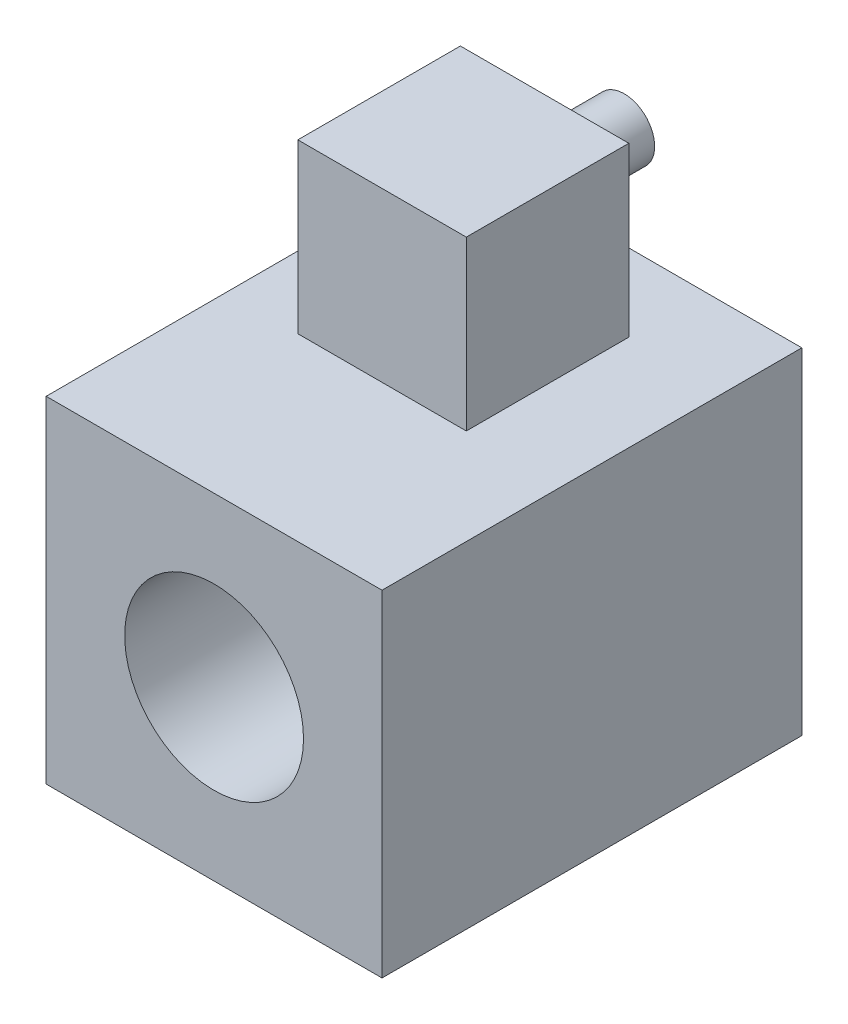
ISO-10303-21;
HEADER;
FILE_DESCRIPTION(('STEP AP214'),'2;1');
FILE_NAME('part.step','',(''),(''),'','','');
FILE_SCHEMA(('AUTOMOTIVE_DESIGN { 1 0 10303 214 1 1 1 1 }'));
ENDSEC;
DATA;
#1=APPLICATION_CONTEXT('core data for automotive mechanical design processes');
#2=APPLICATION_PROTOCOL_DEFINITION('international standard','automotive_design',2000,#1);
#3=PRODUCT_CONTEXT('',#1,'mechanical');
#4=PRODUCT('Part','Part','',(#3));
#5=PRODUCT_RELATED_PRODUCT_CATEGORY('part','',(#4));
#6=PRODUCT_DEFINITION_FORMATION('','',#4);
#7=PRODUCT_DEFINITION_CONTEXT('part definition',#1,'design');
#8=PRODUCT_DEFINITION('design','',#6,#7);
#9=PRODUCT_DEFINITION_SHAPE('','',#8);
#10=(LENGTH_UNIT() NAMED_UNIT(*) SI_UNIT(.MILLI.,.METRE.));
#11=(NAMED_UNIT(*) PLANE_ANGLE_UNIT() SI_UNIT($,.RADIAN.));
#12=(NAMED_UNIT(*) SI_UNIT($,.STERADIAN.) SOLID_ANGLE_UNIT());
#13=UNCERTAINTY_MEASURE_WITH_UNIT(LENGTH_MEASURE(1.E-05),#10,'distance_accuracy_value','');
#14=(GEOMETRIC_REPRESENTATION_CONTEXT(3) GLOBAL_UNCERTAINTY_ASSIGNED_CONTEXT((#13)) GLOBAL_UNIT_ASSIGNED_CONTEXT((#10,
#11,#12)) REPRESENTATION_CONTEXT('',''));
#15=CARTESIAN_POINT('',(0.,0.,0.));
#16=DIRECTION('',(0.,0.,1.));
#17=DIRECTION('',(1.,0.,0.));
#18=AXIS2_PLACEMENT_3D('',#15,#16,#17);
#19=CARTESIAN_POINT('',(20.0000000000014,19.9999999999991,49.9999999999999));
#20=DIRECTION('',(0.,-0.999999999999999,0.));
#21=DIRECTION('',(1.,0.,0.));
#22=AXIS2_PLACEMENT_3D('',#19,#20,#21);
#23=PLANE('',#22);
#24=DIRECTION('',(-1.,0.,0.));
#25=VECTOR('',#24,1.);
#26=CARTESIAN_POINT('',(20.0000000000005,20.,3.33066907387547E-13));
#27=LINE('',#26,#25);
#28=CARTESIAN_POINT('',(20.0000000000005,20.,3.33066907387547E-13));
#29=VERTEX_POINT('',#28);
#30=CARTESIAN_POINT('',(-19.9999999999991,19.9999999999987,-5.55111512312578E-13));
#31=VERTEX_POINT('',#30);
#32=EDGE_CURVE('E138',#29,#31,#27,.T.);
#33=ORIENTED_EDGE('',*,*,#32,.T.);
#34=DIRECTION('',(0.,0.,-0.999999999999998));
#35=VECTOR('',#34,1.);
#36=CARTESIAN_POINT('',(-19.9999999999982,19.9999999999996,49.9999999999994));
#37=LINE('',#36,#35);
#38=CARTESIAN_POINT('',(-19.9999999999982,19.9999999999996,49.9999999999994));
#39=VERTEX_POINT('',#38);
#40=EDGE_CURVE('E144',#39,#31,#37,.T.);
#41=ORIENTED_EDGE('',*,*,#40,.F.);
#42=DIRECTION('',(-1.,0.,0.));
#43=VECTOR('',#42,1.);
#44=CARTESIAN_POINT('',(20.0000000000014,19.9999999999991,49.9999999999999));
#45=LINE('',#44,#43);
#46=CARTESIAN_POINT('',(20.0000000000014,19.9999999999991,49.9999999999999));
#47=VERTEX_POINT('',#46);
#48=EDGE_CURVE('E142',#47,#39,#45,.T.);
#49=ORIENTED_EDGE('',*,*,#48,.F.);
#50=DIRECTION('',(0.,0.,-0.999999999999998));
#51=VECTOR('',#50,1.);
#52=CARTESIAN_POINT('',(20.0000000000014,19.9999999999991,49.9999999999999));
#53=LINE('',#52,#51);
#54=EDGE_CURVE('E154',#47,#29,#53,.T.);
#55=ORIENTED_EDGE('',*,*,#54,.T.);
#56=EDGE_LOOP('',(#33,#41,#49,#55));
#57=FACE_BOUND('',#56,.T.);
#58=DIRECTION('',(0.,0.,0.999999999999998));
#59=VECTOR('',#58,1.);
#60=CARTESIAN_POINT('',(-11.464319015601,20.0000000000009,28.5612602338009));
#61=LINE('',#60,#59);
#62=CARTESIAN_POINT('',(-11.4643190156016,20.0000000000009,9.20417312949018));
#63=VERTEX_POINT('',#62);
#64=CARTESIAN_POINT('',(-11.464319015601,20.0000000000009,28.5612602338009));
#65=VERTEX_POINT('',#64);
#66=EDGE_CURVE('E121',#63,#65,#61,.T.);
#67=ORIENTED_EDGE('',*,*,#66,.F.);
#68=DIRECTION('',(-1.,0.,0.));
#69=VECTOR('',#68,1.);
#70=CARTESIAN_POINT('',(-11.4643190156016,20.0000000000009,9.20417312949018));
#71=LINE('',#70,#69);
#72=CARTESIAN_POINT('',(8.59966577257998,20.0000000000025,9.20417312948985));
#73=VERTEX_POINT('',#72);
#74=EDGE_CURVE('E118',#73,#63,#71,.T.);
#75=ORIENTED_EDGE('',*,*,#74,.F.);
#76=DIRECTION('',(0.,0.,-0.999999999999998));
#77=VECTOR('',#76,1.);
#78=CARTESIAN_POINT('',(8.59966577258153,20.0000000000025,28.5612602338006));
#79=LINE('',#78,#77);
#80=CARTESIAN_POINT('',(8.59966577258153,20.0000000000025,28.5612602338006));
#81=VERTEX_POINT('',#80);
#82=EDGE_CURVE('E56',#81,#73,#79,.T.);
#83=ORIENTED_EDGE('',*,*,#82,.F.);
#84=DIRECTION('',(1.,0.,0.));
#85=VECTOR('',#84,1.);
#86=CARTESIAN_POINT('',(-11.464319015601,20.0000000000009,28.5612602338009));
#87=LINE('',#86,#85);
#88=EDGE_CURVE('E51',#65,#81,#87,.T.);
#89=ORIENTED_EDGE('',*,*,#88,.F.);
#90=EDGE_LOOP('',(#67,#75,#83,#89));
#91=FACE_BOUND('',#90,.T.);
#92=ADVANCED_FACE('F36',(#57,#91),#23,.F.);
#93=CARTESIAN_POINT('',(-19.9999999999978,-20.,49.999999999999));
#94=DIRECTION('',(1.,0.,0.));
#95=DIRECTION('',(0.,0.,-0.999999999999998));
#96=AXIS2_PLACEMENT_3D('',#93,#94,#95);
#97=PLANE('',#96);
#98=DIRECTION('',(0.,-0.999999999999999,0.));
#99=VECTOR('',#98,1.);
#100=CARTESIAN_POINT('',(-19.9999999999991,-19.9999999999996,-8.88178419700125E-13));
#101=LINE('',#100,#99);
#102=CARTESIAN_POINT('',(-19.9999999999991,-19.9999999999996,-8.88178419700125E-13));
#103=VERTEX_POINT('',#102);
#104=EDGE_CURVE('E132',#31,#103,#101,.T.);
#105=ORIENTED_EDGE('',*,*,#104,.T.);
#106=DIRECTION('',(0.,0.,-0.999999999999998));
#107=VECTOR('',#106,1.);
#108=CARTESIAN_POINT('',(-19.9999999999978,-20.,49.999999999999));
#109=LINE('',#108,#107);
#110=CARTESIAN_POINT('',(-19.9999999999978,-20.,49.999999999999));
#111=VERTEX_POINT('',#110);
#112=EDGE_CURVE('E44',#111,#103,#109,.T.);
#113=ORIENTED_EDGE('',*,*,#112,.F.);
#114=DIRECTION('',(0.,-0.999999999999999,0.));
#115=VECTOR('',#114,1.);
#116=CARTESIAN_POINT('',(-19.9999999999978,-20.,49.999999999999));
#117=LINE('',#116,#115);
#118=EDGE_CURVE('E134',#39,#111,#117,.T.);
#119=ORIENTED_EDGE('',*,*,#118,.F.);
#120=ORIENTED_EDGE('',*,*,#40,.T.);
#121=EDGE_LOOP('',(#105,#113,#119,#120));
#122=FACE_BOUND('',#121,.T.);
#123=ADVANCED_FACE('F38',(#122),#97,.F.);
#124=CARTESIAN_POINT('',(20.0000000000018,-19.9999999999991,49.9999999999999));
#125=DIRECTION('',(0.,0.999999999999999,0.));
#126=DIRECTION('',(-1.,0.,0.));
#127=AXIS2_PLACEMENT_3D('',#124,#125,#126);
#128=PLANE('',#127);
#129=DIRECTION('',(1.,0.,0.));
#130=VECTOR('',#129,1.);
#131=CARTESIAN_POINT('',(20.,-19.9999999999991,0.));
#132=LINE('',#131,#130);
#133=CARTESIAN_POINT('',(20.,-19.9999999999991,0.));
#134=VERTEX_POINT('',#133);
#135=EDGE_CURVE('E147',#103,#134,#132,.T.);
#136=ORIENTED_EDGE('',*,*,#135,.T.);
#137=DIRECTION('',(0.,0.,-0.999999999999998));
#138=VECTOR('',#137,1.);
#139=CARTESIAN_POINT('',(20.0000000000018,-19.9999999999991,49.9999999999999));
#140=LINE('',#139,#138);
#141=CARTESIAN_POINT('',(20.0000000000018,-19.9999999999991,49.9999999999999));
#142=VERTEX_POINT('',#141);
#143=EDGE_CURVE('E157',#142,#134,#140,.T.);
#144=ORIENTED_EDGE('',*,*,#143,.F.);
#145=DIRECTION('',(1.,0.,0.));
#146=VECTOR('',#145,1.);
#147=CARTESIAN_POINT('',(20.0000000000018,-19.9999999999991,49.9999999999999));
#148=LINE('',#147,#146);
#149=EDGE_CURVE('E137',#111,#142,#148,.T.);
#150=ORIENTED_EDGE('',*,*,#149,.F.);
#151=ORIENTED_EDGE('',*,*,#112,.T.);
#152=EDGE_LOOP('',(#136,#144,#150,#151));
#153=FACE_BOUND('',#152,.T.);
#154=ADVANCED_FACE('F162',(#153),#128,.F.);
#155=CARTESIAN_POINT('',(20.0000000000018,-19.9999999999991,49.9999999999999));
#156=DIRECTION('',(-1.,0.,0.));
#157=DIRECTION('',(0.,0.,0.999999999999998));
#158=AXIS2_PLACEMENT_3D('',#155,#156,#157);
#159=PLANE('',#158);
#160=DIRECTION('',(0.,0.999999999999999,0.));
#161=VECTOR('',#160,1.);
#162=CARTESIAN_POINT('',(20.,-19.9999999999991,0.));
#163=LINE('',#162,#161);
#164=EDGE_CURVE('E149',#134,#29,#163,.T.);
#165=ORIENTED_EDGE('',*,*,#164,.T.);
#166=ORIENTED_EDGE('',*,*,#54,.F.);
#167=DIRECTION('',(0.,0.999999999999999,0.));
#168=VECTOR('',#167,1.);
#169=CARTESIAN_POINT('',(20.0000000000018,-19.9999999999991,49.9999999999999));
#170=LINE('',#169,#168);
#171=EDGE_CURVE('E140',#142,#47,#170,.T.);
#172=ORIENTED_EDGE('',*,*,#171,.F.);
#173=ORIENTED_EDGE('',*,*,#143,.T.);
#174=EDGE_LOOP('',(#165,#166,#172,#173));
#175=FACE_BOUND('',#174,.T.);
#176=ADVANCED_FACE('F174',(#175),#159,.F.);
#177=CARTESIAN_POINT('',(1.11022302462516E-12,0.,49.9999999999998));
#178=DIRECTION('',(0.,0.,0.999999999999998));
#179=DIRECTION('',(1.,0.,0.));
#180=AXIS2_PLACEMENT_3D('',#177,#178,#179);
#181=PLANE('',#180);
#182=CARTESIAN_POINT('',(1.11022302462516E-12,0.,49.9999999999998));
#183=DIRECTION('',(0.,0.,0.999999999999998));
#184=DIRECTION('',(1.,0.,0.));
#185=AXIS2_PLACEMENT_3D('',#182,#183,#184);
#186=CIRCLE('',#185,10.65);
#187=CARTESIAN_POINT('',(10.65,0.,49.9999999999998));
#188=VERTEX_POINT('',#187);
#189=EDGE_CURVE('E122',#188,#188,#186,.T.);
#190=ORIENTED_EDGE('',*,*,#189,.F.);
#191=EDGE_LOOP('',(#190));
#192=FACE_BOUND('',#191,.T.);
#193=ORIENTED_EDGE('',*,*,#118,.T.);
#194=ORIENTED_EDGE('',*,*,#149,.T.);
#195=ORIENTED_EDGE('',*,*,#171,.T.);
#196=ORIENTED_EDGE('',*,*,#48,.T.);
#197=EDGE_LOOP('',(#193,#194,#195,#196));
#198=FACE_BOUND('',#197,.T.);
#199=ADVANCED_FACE('F179',(#192,#198),#181,.T.);
#200=CARTESIAN_POINT('',(0.,0.,0.));
#201=DIRECTION('',(0.,0.,0.999999999999998));
#202=DIRECTION('',(1.,0.,0.));
#203=AXIS2_PLACEMENT_3D('',#200,#201,#202);
#204=PLANE('',#203);
#205=CARTESIAN_POINT('',(0.,0.,0.));
#206=DIRECTION('',(0.,0.,0.999999999999998));
#207=DIRECTION('',(1.,0.,0.));
#208=AXIS2_PLACEMENT_3D('',#205,#206,#207);
#209=CIRCLE('',#208,10.65);
#210=CARTESIAN_POINT('',(10.65,0.,0.));
#211=VERTEX_POINT('',#210);
#212=EDGE_CURVE('E125',#211,#211,#209,.T.);
#213=ORIENTED_EDGE('',*,*,#212,.T.);
#214=EDGE_LOOP('',(#213));
#215=FACE_BOUND('',#214,.T.);
#216=ORIENTED_EDGE('',*,*,#104,.F.);
#217=ORIENTED_EDGE('',*,*,#32,.F.);
#218=ORIENTED_EDGE('',*,*,#164,.F.);
#219=ORIENTED_EDGE('',*,*,#135,.F.);
#220=EDGE_LOOP('',(#216,#217,#218,#219));
#221=FACE_BOUND('',#220,.T.);
#222=ADVANCED_FACE('F170',(#215,#221),#204,.F.);
#223=CARTESIAN_POINT('',(0.,0.,0.));
#224=DIRECTION('',(0.,0.,0.999999999999998));
#225=DIRECTION('',(1.,0.,0.));
#226=AXIS2_PLACEMENT_3D('',#223,#224,#225);
#227=CYLINDRICAL_SURFACE('',#226,10.65);
#228=CARTESIAN_POINT('',(10.65,0.,0.));
#229=CARTESIAN_POINT('',(10.65,0.,0.520833333333332));
#230=CARTESIAN_POINT('',(10.65,0.,1.04166666666666));
#231=CARTESIAN_POINT('',(10.65,0.,2.08333333333333));
#232=CARTESIAN_POINT('',(10.65,0.,2.60416666666666));
#233=CARTESIAN_POINT('',(10.65,0.,3.64583333333332));
#234=CARTESIAN_POINT('',(10.65,0.,4.16666666666665));
#235=CARTESIAN_POINT('',(10.65,0.,5.20833333333332));
#236=CARTESIAN_POINT('',(10.65,0.,5.72916666666665));
#237=CARTESIAN_POINT('',(10.65,0.,6.77083333333331));
#238=CARTESIAN_POINT('',(10.65,0.,7.29166666666664));
#239=CARTESIAN_POINT('',(10.65,0.,8.33333333333331));
#240=CARTESIAN_POINT('',(10.65,0.,8.85416666666664));
#241=CARTESIAN_POINT('',(10.65,0.,9.8958333333333));
#242=CARTESIAN_POINT('',(10.65,0.,10.4166666666666));
#243=CARTESIAN_POINT('',(10.65,0.,11.4583333333333));
#244=CARTESIAN_POINT('',(10.65,0.,11.9791666666666));
#245=CARTESIAN_POINT('',(10.65,0.,13.0208333333333));
#246=CARTESIAN_POINT('',(10.65,0.,13.5416666666666));
#247=CARTESIAN_POINT('',(10.65,0.,14.5833333333333));
#248=CARTESIAN_POINT('',(10.65,0.,15.1041666666666));
#249=CARTESIAN_POINT('',(10.65,0.,16.1458333333333));
#250=CARTESIAN_POINT('',(10.65,0.,16.6666666666666));
#251=CARTESIAN_POINT('',(10.65,0.,17.7083333333333));
#252=CARTESIAN_POINT('',(10.65,0.,18.2291666666666));
#253=CARTESIAN_POINT('',(10.65,0.,19.2708333333333));
#254=CARTESIAN_POINT('',(10.65,0.,19.7916666666666));
#255=CARTESIAN_POINT('',(10.65,0.,20.8333333333333));
#256=CARTESIAN_POINT('',(10.65,0.,21.3541666666666));
#257=CARTESIAN_POINT('',(10.65,0.,22.3958333333333));
#258=CARTESIAN_POINT('',(10.65,0.,22.9166666666666));
#259=CARTESIAN_POINT('',(10.65,0.,23.9583333333333));
#260=CARTESIAN_POINT('',(10.65,0.,24.4791666666666));
#261=CARTESIAN_POINT('',(10.65,0.,25.5208333333332));
#262=CARTESIAN_POINT('',(10.65,0.,26.0416666666666));
#263=CARTESIAN_POINT('',(10.65,0.,27.0833333333332));
#264=CARTESIAN_POINT('',(10.65,0.,27.6041666666666));
#265=CARTESIAN_POINT('',(10.65,0.,28.6458333333332));
#266=CARTESIAN_POINT('',(10.65,0.,29.1666666666666));
#267=CARTESIAN_POINT('',(10.65,0.,30.2083333333332));
#268=CARTESIAN_POINT('',(10.65,0.,30.7291666666666));
#269=CARTESIAN_POINT('',(10.65,0.,31.7708333333332));
#270=CARTESIAN_POINT('',(10.65,0.,32.2916666666666));
#271=CARTESIAN_POINT('',(10.65,0.,33.3333333333332));
#272=CARTESIAN_POINT('',(10.65,0.,33.8541666666666));
#273=CARTESIAN_POINT('',(10.65,0.,34.8958333333332));
#274=CARTESIAN_POINT('',(10.65,0.,35.4166666666666));
#275=CARTESIAN_POINT('',(10.65,0.,36.4583333333332));
#276=CARTESIAN_POINT('',(10.65,0.,36.9791666666665));
#277=CARTESIAN_POINT('',(10.65,0.,38.0208333333332));
#278=CARTESIAN_POINT('',(10.65,0.,38.5416666666665));
#279=CARTESIAN_POINT('',(10.65,0.,39.5833333333332));
#280=CARTESIAN_POINT('',(10.65,0.,40.1041666666665));
#281=CARTESIAN_POINT('',(10.65,0.,41.1458333333332));
#282=CARTESIAN_POINT('',(10.65,0.,41.6666666666665));
#283=CARTESIAN_POINT('',(10.65,0.,42.7083333333332));
#284=CARTESIAN_POINT('',(10.65,0.,43.2291666666665));
#285=CARTESIAN_POINT('',(10.65,0.,44.2708333333332));
#286=CARTESIAN_POINT('',(10.65,0.,44.7916666666665));
#287=CARTESIAN_POINT('',(10.65,0.,45.8333333333332));
#288=CARTESIAN_POINT('',(10.65,0.,46.3541666666665));
#289=CARTESIAN_POINT('',(10.65,0.,47.3958333333332));
#290=CARTESIAN_POINT('',(10.65,0.,47.9166666666665));
#291=CARTESIAN_POINT('',(10.65,0.,48.9583333333332));
#292=CARTESIAN_POINT('',(10.65,0.,49.4791666666665));
#293=CARTESIAN_POINT('',(10.65,0.,49.9999999999998));
#294=B_SPLINE_CURVE_WITH_KNOTS('',3,(#228,#229,#230,#231,#232,#233,#234,#235,#236,#237,#238,
#239,#240,#241,#242,#243,#244,#245,#246,#247,#248,#249,#250,#251,#252,#253,#254,#255,#256,#257,
#258,#259,#260,#261,#262,#263,#264,#265,#266,#267,#268,#269,#270,#271,#272,#273,#274,#275,#276,
#277,#278,#279,#280,#281,#282,#283,#284,#285,#286,#287,#288,#289,#290,#291,#292,#293),
.UNSPECIFIED.,.F.,.F.,(4,2,2,2,2,2,2,2,2,2,2,2,2,2,2,2,2,2,2,2,2,2,2,2,2,2,2,2,2,2,2,2,4),(0.,
1.56249999999999,3.12499999999999,4.68749999999998,6.24999999999998,7.81249999999997,
9.37499999999997,10.9375,12.5,14.0625,15.6249999999999,17.1874999999999,18.7499999999999,
20.3124999999999,21.8749999999999,23.4374999999999,24.9999999999999,26.5624999999999,
28.1249999999999,29.6874999999999,31.2499999999999,32.8124999999999,34.3749999999999,
35.9374999999999,37.4999999999999,39.0624999999999,40.6249999999999,42.1874999999999,
43.7499999999999,45.3124999999998,46.8749999999998,48.4374999999998,49.9999999999998),.UNSPECIFIED.);
#295=EDGE_CURVE('BSEAM187',#211,#188,#294,.T.);
#296=ORIENTED_EDGE('',*,*,#212,.F.);
#297=ORIENTED_EDGE('',*,*,#189,.T.);
#298=ORIENTED_EDGE('',*,*,#295,.T.);
#299=ORIENTED_EDGE('',*,*,#295,.F.);
#300=EDGE_LOOP('',(#296,#298,#297,#299));
#301=FACE_BOUND('',#300,.T.);
#302=ADVANCED_FACE('F187',(#301),#227,.F.);
#303=CARTESIAN_POINT('',(-11.4643190156007,40.0000000000003,28.5612602338005));
#304=DIRECTION('',(1.,0.,0.));
#305=DIRECTION('',(0.,0.999999999999999,0.));
#306=AXIS2_PLACEMENT_3D('',#303,#304,#305);
#307=PLANE('',#306);
#308=ORIENTED_EDGE('',*,*,#66,.T.);
#309=DIRECTION('',(0.,-0.999999999999999,0.));
#310=VECTOR('',#309,1.);
#311=CARTESIAN_POINT('',(-11.4643190156007,40.0000000000003,28.5612602338005));
#312=LINE('',#311,#310);
#313=CARTESIAN_POINT('',(-11.4643190156007,40.0000000000003,28.5612602338005));
#314=VERTEX_POINT('',#313);
#315=EDGE_CURVE('E102',#314,#65,#312,.T.);
#316=ORIENTED_EDGE('',*,*,#315,.F.);
#317=DIRECTION('',(0.,0.,0.999999999999998));
#318=VECTOR('',#317,1.);
#319=CARTESIAN_POINT('',(-11.4643190156007,40.0000000000003,28.5612602338005));
#320=LINE('',#319,#318);
#321=CARTESIAN_POINT('',(-11.4643190156012,40.0000000000003,9.20417312948974));
#322=VERTEX_POINT('',#321);
#323=EDGE_CURVE('E109',#322,#314,#320,.T.);
#324=ORIENTED_EDGE('',*,*,#323,.F.);
#325=DIRECTION('',(0.,-0.999999999999999,0.));
#326=VECTOR('',#325,1.);
#327=CARTESIAN_POINT('',(-11.4643190156012,40.0000000000003,9.20417312948974));
#328=LINE('',#327,#326);
#329=EDGE_CURVE('E302',#322,#63,#328,.T.);
#330=ORIENTED_EDGE('',*,*,#329,.T.);
#331=EDGE_LOOP('',(#308,#316,#324,#330));
#332=FACE_BOUND('',#331,.T.);
#333=ADVANCED_FACE('F120',(#332),#307,.F.);
#334=CARTESIAN_POINT('',(-11.4643190156007,40.0000000000003,28.5612602338005));
#335=DIRECTION('',(0.,0.,-0.999999999999998));
#336=DIRECTION('',(-1.,0.,0.));
#337=AXIS2_PLACEMENT_3D('',#334,#335,#336);
#338=PLANE('',#337);
#339=ORIENTED_EDGE('',*,*,#88,.T.);
#340=DIRECTION('',(0.,-0.999999999999999,0.));
#341=VECTOR('',#340,1.);
#342=CARTESIAN_POINT('',(8.59966577257976,39.9999999999983,28.5612602338006));
#343=LINE('',#342,#341);
#344=CARTESIAN_POINT('',(8.59966577257976,39.9999999999983,28.5612602338006));
#345=VERTEX_POINT('',#344);
#346=EDGE_CURVE('E105',#345,#81,#343,.T.);
#347=ORIENTED_EDGE('',*,*,#346,.F.);
#348=DIRECTION('',(1.,0.,0.));
#349=VECTOR('',#348,1.);
#350=CARTESIAN_POINT('',(-11.4643190156007,40.0000000000003,28.5612602338005));
#351=LINE('',#350,#349);
#352=EDGE_CURVE('E98',#314,#345,#351,.T.);
#353=ORIENTED_EDGE('',*,*,#352,.F.);
#354=ORIENTED_EDGE('',*,*,#315,.T.);
#355=EDGE_LOOP('',(#339,#347,#353,#354));
#356=FACE_BOUND('',#355,.T.);
#357=ADVANCED_FACE('F100',(#356),#338,.F.);
#358=CARTESIAN_POINT('',(8.59966577257976,39.9999999999983,28.5612602338006));
#359=DIRECTION('',(-1.,0.,0.));
#360=DIRECTION('',(0.,-0.999999999999999,0.));
#361=AXIS2_PLACEMENT_3D('',#358,#359,#360);
#362=PLANE('',#361);
#363=ORIENTED_EDGE('',*,*,#82,.T.);
#364=DIRECTION('',(0.,-0.999999999999999,0.));
#365=VECTOR('',#364,1.);
#366=CARTESIAN_POINT('',(8.59966577257909,39.9999999999983,9.20417312948985));
#367=LINE('',#366,#365);
#368=CARTESIAN_POINT('',(8.59966577257909,39.9999999999983,9.20417312948985));
#369=VERTEX_POINT('',#368);
#370=EDGE_CURVE('E127',#369,#73,#367,.T.);
#371=ORIENTED_EDGE('',*,*,#370,.F.);
#372=DIRECTION('',(0.,0.,-0.999999999999998));
#373=VECTOR('',#372,1.);
#374=CARTESIAN_POINT('',(8.59966577257976,39.9999999999983,28.5612602338006));
#375=LINE('',#374,#373);
#376=EDGE_CURVE('E108',#345,#369,#375,.T.);
#377=ORIENTED_EDGE('',*,*,#376,.F.);
#378=ORIENTED_EDGE('',*,*,#346,.T.);
#379=EDGE_LOOP('',(#363,#371,#377,#378));
#380=FACE_BOUND('',#379,.T.);
#381=ADVANCED_FACE('F244',(#380),#362,.F.);
#382=CARTESIAN_POINT('',(-11.4643190156012,40.0000000000003,9.20417312948974));
#383=DIRECTION('',(0.,0.,0.999999999999998));
#384=DIRECTION('',(1.,0.,0.));
#385=AXIS2_PLACEMENT_3D('',#382,#383,#384);
#386=PLANE('',#385);
#387=CARTESIAN_POINT('',(-1.9449177963784,31.2141461724291,9.20417312948974));
#388=DIRECTION('',(0.,0.,0.999999999999998));
#389=DIRECTION('',(1.,0.,0.));
#390=AXIS2_PLACEMENT_3D('',#387,#388,#389);
#391=CIRCLE('',#390,3.61937080947428);
#392=CARTESIAN_POINT('',(1.6744530130961,31.2141461724291,9.20417312948974));
#393=VERTEX_POINT('',#392);
#394=EDGE_CURVE('E11',#393,#393,#391,.F.);
#395=ORIENTED_EDGE('',*,*,#394,.F.);
#396=EDGE_LOOP('',(#395));
#397=FACE_BOUND('',#396,.T.);
#398=ORIENTED_EDGE('',*,*,#74,.T.);
#399=ORIENTED_EDGE('',*,*,#329,.F.);
#400=DIRECTION('',(-1.,0.,0.));
#401=VECTOR('',#400,1.);
#402=CARTESIAN_POINT('',(-11.4643190156012,40.0000000000003,9.20417312948974));
#403=LINE('',#402,#401);
#404=EDGE_CURVE('E114',#369,#322,#403,.T.);
#405=ORIENTED_EDGE('',*,*,#404,.F.);
#406=ORIENTED_EDGE('',*,*,#370,.T.);
#407=EDGE_LOOP('',(#398,#399,#405,#406));
#408=FACE_BOUND('',#407,.T.);
#409=ADVANCED_FACE('F253',(#397,#408),#386,.F.);
#410=CARTESIAN_POINT('',(3.33066907387547E-12,39.9999999999987,-8.88178419700125E-13));
#411=DIRECTION('',(0.,-0.999999999999999,0.));
#412=DIRECTION('',(1.,0.,0.));
#413=AXIS2_PLACEMENT_3D('',#410,#411,#412);
#414=PLANE('',#413);
#415=ORIENTED_EDGE('',*,*,#323,.T.);
#416=ORIENTED_EDGE('',*,*,#352,.T.);
#417=ORIENTED_EDGE('',*,*,#376,.T.);
#418=ORIENTED_EDGE('',*,*,#404,.T.);
#419=EDGE_LOOP('',(#415,#416,#417,#418));
#420=FACE_BOUND('',#419,.T.);
#421=ADVANCED_FACE('F112',(#420),#414,.F.);
#422=CARTESIAN_POINT('',(-1.94491779637818,31.2141461724291,-0.795826870510274));
#423=DIRECTION('',(0.,0.,0.999999999999998));
#424=DIRECTION('',(1.,0.,0.));
#425=AXIS2_PLACEMENT_3D('',#422,#423,#424);
#426=CYLINDRICAL_SURFACE('',#425,3.61937080947428);
#427=CARTESIAN_POINT('',(-1.94491779637818,31.2141461724291,-0.795826870510274));
#428=DIRECTION('',(0.,0.,-0.999999999999998));
#429=DIRECTION('',(-1.,0.,0.));
#430=AXIS2_PLACEMENT_3D('',#427,#428,#429);
#431=CIRCLE('',#430,3.61937080947428);
#432=CARTESIAN_POINT('',(1.6744530130961,31.2141461724291,-0.795826870510274));
#433=VERTEX_POINT('',#432);
#434=EDGE_CURVE('E297',#433,#433,#431,.T.);
#435=CARTESIAN_POINT('',(1.6744530130961,31.2141461724291,-0.795826870510274));
#436=CARTESIAN_POINT('',(1.6744530130961,31.2141461724291,-0.691660203843607));
#437=CARTESIAN_POINT('',(1.6744530130961,31.2141461724291,-0.587493537176941));
#438=CARTESIAN_POINT('',(1.6744530130961,31.2141461724291,-0.379160203843607));
#439=CARTESIAN_POINT('',(1.6744530130961,31.2141461724291,-0.27499353717694));
#440=CARTESIAN_POINT('',(1.6744530130961,31.2141461724291,-0.0666602038436069));
#441=CARTESIAN_POINT('',(1.6744530130961,31.2141461724291,0.0375064628230599));
#442=CARTESIAN_POINT('',(1.6744530130961,31.2141461724291,0.245839796156393));
#443=CARTESIAN_POINT('',(1.6744530130961,31.2141461724291,0.35000646282306));
#444=CARTESIAN_POINT('',(1.6744530130961,31.2141461724291,0.558339796156393));
#445=CARTESIAN_POINT('',(1.6744530130961,31.2141461724291,0.66250646282306));
#446=CARTESIAN_POINT('',(1.6744530130961,31.2141461724291,0.870839796156394));
#447=CARTESIAN_POINT('',(1.6744530130961,31.2141461724291,0.97500646282306));
#448=CARTESIAN_POINT('',(1.6744530130961,31.2141461724291,1.18333979615639));
#449=CARTESIAN_POINT('',(1.6744530130961,31.2141461724291,1.28750646282306));
#450=CARTESIAN_POINT('',(1.6744530130961,31.2141461724291,1.49583979615639));
#451=CARTESIAN_POINT('',(1.6744530130961,31.2141461724291,1.60000646282306));
#452=CARTESIAN_POINT('',(1.6744530130961,31.2141461724291,1.80833979615639));
#453=CARTESIAN_POINT('',(1.6744530130961,31.2141461724291,1.91250646282306));
#454=CARTESIAN_POINT('',(1.6744530130961,31.2141461724291,2.12083979615639));
#455=CARTESIAN_POINT('',(1.6744530130961,31.2141461724291,2.22500646282306));
#456=CARTESIAN_POINT('',(1.6744530130961,31.2141461724291,2.43333979615639));
#457=CARTESIAN_POINT('',(1.6744530130961,31.2141461724291,2.53750646282306));
#458=CARTESIAN_POINT('',(1.6744530130961,31.2141461724291,2.7458397961564));
#459=CARTESIAN_POINT('',(1.6744530130961,31.2141461724291,2.85000646282306));
#460=CARTESIAN_POINT('',(1.6744530130961,31.2141461724291,3.0583397961564));
#461=CARTESIAN_POINT('',(1.6744530130961,31.2141461724291,3.16250646282306));
#462=CARTESIAN_POINT('',(1.6744530130961,31.2141461724291,3.3708397961564));
#463=CARTESIAN_POINT('',(1.6744530130961,31.2141461724291,3.47500646282306));
#464=CARTESIAN_POINT('',(1.6744530130961,31.2141461724291,3.6833397961564));
#465=CARTESIAN_POINT('',(1.6744530130961,31.2141461724291,3.78750646282306));
#466=CARTESIAN_POINT('',(1.6744530130961,31.2141461724291,3.9958397961564));
#467=CARTESIAN_POINT('',(1.6744530130961,31.2141461724291,4.10000646282306));
#468=CARTESIAN_POINT('',(1.6744530130961,31.2141461724291,4.3083397961564));
#469=CARTESIAN_POINT('',(1.6744530130961,31.2141461724291,4.41250646282306));
#470=CARTESIAN_POINT('',(1.6744530130961,31.2141461724291,4.6208397961564));
#471=CARTESIAN_POINT('',(1.6744530130961,31.2141461724291,4.72500646282306));
#472=CARTESIAN_POINT('',(1.6744530130961,31.2141461724291,4.9333397961564));
#473=CARTESIAN_POINT('',(1.6744530130961,31.2141461724291,5.03750646282306));
#474=CARTESIAN_POINT('',(1.6744530130961,31.2141461724291,5.2458397961564));
#475=CARTESIAN_POINT('',(1.6744530130961,31.2141461724291,5.35000646282306));
#476=CARTESIAN_POINT('',(1.6744530130961,31.2141461724291,5.5583397961564));
#477=CARTESIAN_POINT('',(1.6744530130961,31.2141461724291,5.66250646282306));
#478=CARTESIAN_POINT('',(1.6744530130961,31.2141461724291,5.8708397961564));
#479=CARTESIAN_POINT('',(1.6744530130961,31.2141461724291,5.97500646282307));
#480=CARTESIAN_POINT('',(1.6744530130961,31.2141461724291,6.1833397961564));
#481=CARTESIAN_POINT('',(1.6744530130961,31.2141461724291,6.28750646282307));
#482=CARTESIAN_POINT('',(1.6744530130961,31.2141461724291,6.4958397961564));
#483=CARTESIAN_POINT('',(1.6744530130961,31.2141461724291,6.60000646282307));
#484=CARTESIAN_POINT('',(1.6744530130961,31.2141461724291,6.8083397961564));
#485=CARTESIAN_POINT('',(1.6744530130961,31.2141461724291,6.91250646282307));
#486=CARTESIAN_POINT('',(1.6744530130961,31.2141461724291,7.1208397961564));
#487=CARTESIAN_POINT('',(1.6744530130961,31.2141461724291,7.22500646282307));
#488=CARTESIAN_POINT('',(1.6744530130961,31.2141461724291,7.4333397961564));
#489=CARTESIAN_POINT('',(1.6744530130961,31.2141461724291,7.53750646282306));
#490=CARTESIAN_POINT('',(1.6744530130961,31.2141461724291,7.7458397961564));
#491=CARTESIAN_POINT('',(1.6744530130961,31.2141461724291,7.85000646282307));
#492=CARTESIAN_POINT('',(1.6744530130961,31.2141461724291,8.0583397961564));
#493=CARTESIAN_POINT('',(1.6744530130961,31.2141461724291,8.16250646282307));
#494=CARTESIAN_POINT('',(1.6744530130961,31.2141461724291,8.3708397961564));
#495=CARTESIAN_POINT('',(1.6744530130961,31.2141461724291,8.47500646282307));
#496=CARTESIAN_POINT('',(1.6744530130961,31.2141461724291,8.6833397961564));
#497=CARTESIAN_POINT('',(1.6744530130961,31.2141461724291,8.78750646282307));
#498=CARTESIAN_POINT('',(1.6744530130961,31.2141461724291,8.9958397961564));
#499=CARTESIAN_POINT('',(1.6744530130961,31.2141461724291,9.10000646282307));
#500=CARTESIAN_POINT('',(1.6744530130961,31.2141461724291,9.20417312948974));
#501=B_SPLINE_CURVE_WITH_KNOTS('',3,(#435,#436,#437,#438,#439,#440,#441,#442,#443,#444,#445,
#446,#447,#448,#449,#450,#451,#452,#453,#454,#455,#456,#457,#458,#459,#460,#461,#462,#463,#464,
#465,#466,#467,#468,#469,#470,#471,#472,#473,#474,#475,#476,#477,#478,#479,#480,#481,#482,#483,
#484,#485,#486,#487,#488,#489,#490,#491,#492,#493,#494,#495,#496,#497,#498,#499,#500),
.UNSPECIFIED.,.F.,.F.,(4,2,2,2,2,2,2,2,2,2,2,2,2,2,2,2,2,2,2,2,2,2,2,2,2,2,2,2,2,2,2,2,4),(0.,
0.3125,0.625000000000001,0.937500000000001,1.25,1.5625,1.875,2.1875,2.5,2.8125,3.125,3.4375,
3.75,4.0625,4.375,4.6875,5.,5.3125,5.625,5.93750000000001,6.25,6.56250000000001,
6.87500000000001,7.18750000000001,7.50000000000001,7.81250000000001,8.12500000000001,
8.43750000000001,8.75000000000001,9.06250000000001,9.37500000000001,9.68750000000001,10.),.UNSPECIFIED.);
#502=EDGE_CURVE('BSEAM272',#433,#393,#501,.T.);
#503=ORIENTED_EDGE('',*,*,#434,.F.);
#504=ORIENTED_EDGE('',*,*,#394,.T.);
#505=ORIENTED_EDGE('',*,*,#502,.T.);
#506=ORIENTED_EDGE('',*,*,#502,.F.);
#507=EDGE_LOOP('',(#503,#505,#504,#506));
#508=FACE_BOUND('',#507,.T.);
#509=ADVANCED_FACE('F272',(#508),#426,.T.);
#510=CARTESIAN_POINT('',(-1.94491779637818,31.2141461724291,-0.795826870510274));
#511=DIRECTION('',(0.,0.,-0.999999999999998));
#512=DIRECTION('',(-1.,0.,0.));
#513=AXIS2_PLACEMENT_3D('',#510,#511,#512);
#514=PLANE('',#513);
#515=ORIENTED_EDGE('',*,*,#434,.T.);
#516=EDGE_LOOP('',(#515));
#517=FACE_BOUND('',#516,.T.);
#518=ADVANCED_FACE('F281',(#517),#514,.T.);
#519=CLOSED_SHELL('',(#92,#123,#154,#176,#199,#222,#302,#333,#357,#381,#409,#421,#509,#518));
#520=MANIFOLD_SOLID_BREP('B2',#519);
#521=ADVANCED_BREP_SHAPE_REPRESENTATION('',(#18,#520),#14);
#522=SHAPE_DEFINITION_REPRESENTATION(#9,#521);
ENDSEC;
END-ISO-10303-21;
